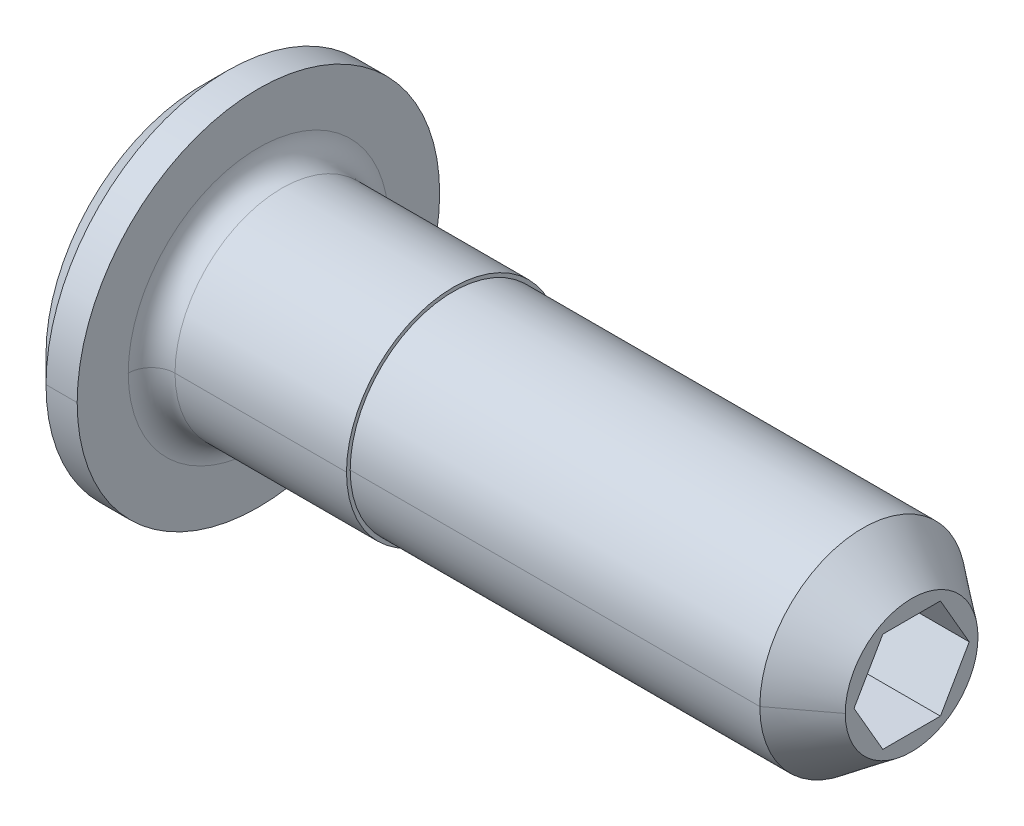
ISO-10303-21;
HEADER;
FILE_DESCRIPTION(('STEP AP214'),'2;1');
FILE_NAME('part.step','',(''),(''),'','','');
FILE_SCHEMA(('AUTOMOTIVE_DESIGN { 1 0 10303 214 1 1 1 1 }'));
ENDSEC;
DATA;
#1=APPLICATION_CONTEXT('core data for automotive mechanical design processes');
#2=APPLICATION_PROTOCOL_DEFINITION('international standard','automotive_design',2000,#1);
#3=PRODUCT_CONTEXT('',#1,'mechanical');
#4=PRODUCT('Part','Part','',(#3));
#5=PRODUCT_RELATED_PRODUCT_CATEGORY('part','',(#4));
#6=PRODUCT_DEFINITION_FORMATION('','',#4);
#7=PRODUCT_DEFINITION_CONTEXT('part definition',#1,'design');
#8=PRODUCT_DEFINITION('design','',#6,#7);
#9=PRODUCT_DEFINITION_SHAPE('','',#8);
#10=(LENGTH_UNIT() NAMED_UNIT(*) SI_UNIT(.MILLI.,.METRE.));
#11=(NAMED_UNIT(*) PLANE_ANGLE_UNIT() SI_UNIT($,.RADIAN.));
#12=(NAMED_UNIT(*) SI_UNIT($,.STERADIAN.) SOLID_ANGLE_UNIT());
#13=UNCERTAINTY_MEASURE_WITH_UNIT(LENGTH_MEASURE(1.E-05),#10,'distance_accuracy_value','');
#14=(GEOMETRIC_REPRESENTATION_CONTEXT(3) GLOBAL_UNCERTAINTY_ASSIGNED_CONTEXT((#13)) GLOBAL_UNIT_ASSIGNED_CONTEXT((#10,
#11,#12)) REPRESENTATION_CONTEXT('',''));
#15=CARTESIAN_POINT('',(0.,0.,0.));
#16=DIRECTION('',(0.,0.,1.));
#17=DIRECTION('',(1.,0.,0.));
#18=AXIS2_PLACEMENT_3D('',#15,#16,#17);
#19=CARTESIAN_POINT('',(9.2329,0.,0.938540597594654));
#20=DIRECTION('',(0.,-0.50000000000001,-0.866025403784433));
#21=DIRECTION('',(0.,-0.866025403784433,0.50000000000001));
#22=AXIS2_PLACEMENT_3D('',#19,#20,#21);
#23=PLANE('',#22);
#24=DIRECTION('',(0.,0.866025403784433,-0.50000000000001));
#25=VECTOR('',#24,1.);
#26=CARTESIAN_POINT('',(11.5824,0.,0.938540597594654));
#27=LINE('',#26,#25);
#28=CARTESIAN_POINT('',(11.5824,0.,0.938540597594654));
#29=VERTEX_POINT('',#28);
#30=CARTESIAN_POINT('',(11.5824,0.8128,0.469270298797319));
#31=VERTEX_POINT('',#30);
#32=EDGE_CURVE('E270',#29,#31,#27,.T.);
#33=ORIENTED_EDGE('',*,*,#32,.F.);
#34=DIRECTION('',(1.,0.,0.));
#35=VECTOR('',#34,1.);
#36=CARTESIAN_POINT('',(9.2329,0.,0.938540597594654));
#37=LINE('',#36,#35);
#38=CARTESIAN_POINT('',(9.2329,0.,0.938540597594654));
#39=VERTEX_POINT('',#38);
#40=EDGE_CURVE('E10',#39,#29,#37,.T.);
#41=ORIENTED_EDGE('',*,*,#40,.F.);
#42=DIRECTION('',(0.,0.866025403784433,-0.50000000000001));
#43=VECTOR('',#42,1.);
#44=CARTESIAN_POINT('',(9.2329,0.,0.938540597594654));
#45=LINE('',#44,#43);
#46=CARTESIAN_POINT('',(9.2329,0.8128,0.469270298797319));
#47=VERTEX_POINT('',#46);
#48=EDGE_CURVE('E301',#39,#47,#45,.T.);
#49=ORIENTED_EDGE('',*,*,#48,.T.);
#50=DIRECTION('',(1.,0.,0.));
#51=VECTOR('',#50,1.);
#52=CARTESIAN_POINT('',(9.2329,0.8128,0.469270298797325));
#53=LINE('',#52,#51);
#54=EDGE_CURVE('E293',#47,#31,#53,.T.);
#55=ORIENTED_EDGE('',*,*,#54,.T.);
#56=EDGE_LOOP('',(#33,#41,#49,#55));
#57=FACE_BOUND('',#56,.T.);
#58=ADVANCED_FACE('F16',(#57),#23,.T.);
#59=CARTESIAN_POINT('',(9.2329,-0.8128,0.469270298797337));
#60=DIRECTION('',(0.,0.499999999999992,-0.866025403784443));
#61=DIRECTION('',(-1.,0.,0.));
#62=AXIS2_PLACEMENT_3D('',#59,#60,#61);
#63=PLANE('',#62);
#64=DIRECTION('',(0.,0.866025403784443,0.499999999999992));
#65=VECTOR('',#64,1.);
#66=CARTESIAN_POINT('',(11.5824,-0.8128,0.469270298797337));
#67=LINE('',#66,#65);
#68=CARTESIAN_POINT('',(11.5824,-0.8128,0.469270298797337));
#69=VERTEX_POINT('',#68);
#70=EDGE_CURVE('E266',#69,#29,#67,.T.);
#71=ORIENTED_EDGE('',*,*,#70,.F.);
#72=DIRECTION('',(1.,0.,0.));
#73=VECTOR('',#72,1.);
#74=CARTESIAN_POINT('',(9.2329,-0.8128,0.469270298797325));
#75=LINE('',#74,#73);
#76=CARTESIAN_POINT('',(9.2329,-0.8128,0.469270298797325));
#77=VERTEX_POINT('',#76);
#78=EDGE_CURVE('E19',#77,#69,#75,.T.);
#79=ORIENTED_EDGE('',*,*,#78,.F.);
#80=DIRECTION('',(0.,0.866025403784443,0.499999999999992));
#81=VECTOR('',#80,1.);
#82=CARTESIAN_POINT('',(9.2329,-0.8128,0.469270298797337));
#83=LINE('',#82,#81);
#84=EDGE_CURVE('E304',#77,#39,#83,.T.);
#85=ORIENTED_EDGE('',*,*,#84,.T.);
#86=ORIENTED_EDGE('',*,*,#40,.T.);
#87=EDGE_LOOP('',(#71,#79,#85,#86));
#88=FACE_BOUND('',#87,.T.);
#89=ADVANCED_FACE('F326',(#88),#63,.T.);
#90=CARTESIAN_POINT('',(9.2329,-0.8128,-0.469270298797325));
#91=DIRECTION('',(0.,1.,0.));
#92=DIRECTION('',(1.,0.,0.));
#93=AXIS2_PLACEMENT_3D('',#90,#91,#92);
#94=PLANE('',#93);
#95=DIRECTION('',(0.,0.,1.));
#96=VECTOR('',#95,1.);
#97=CARTESIAN_POINT('',(11.5824,-0.8128,-0.469270298797325));
#98=LINE('',#97,#96);
#99=CARTESIAN_POINT('',(11.5824,-0.8128,-0.469270298797325));
#100=VERTEX_POINT('',#99);
#101=EDGE_CURVE('E271',#100,#69,#98,.T.);
#102=ORIENTED_EDGE('',*,*,#101,.F.);
#103=DIRECTION('',(1.,0.,0.));
#104=VECTOR('',#103,1.);
#105=CARTESIAN_POINT('',(9.2329,-0.8128,-0.469270298797325));
#106=LINE('',#105,#104);
#107=CARTESIAN_POINT('',(9.2329,-0.8128,-0.469270298797325));
#108=VERTEX_POINT('',#107);
#109=EDGE_CURVE('E49',#108,#100,#106,.T.);
#110=ORIENTED_EDGE('',*,*,#109,.F.);
#111=DIRECTION('',(0.,0.,1.));
#112=VECTOR('',#111,1.);
#113=CARTESIAN_POINT('',(9.2329,-0.8128,-0.469270298797325));
#114=LINE('',#113,#112);
#115=EDGE_CURVE('E241',#108,#77,#114,.T.);
#116=ORIENTED_EDGE('',*,*,#115,.T.);
#117=ORIENTED_EDGE('',*,*,#78,.T.);
#118=EDGE_LOOP('',(#102,#110,#116,#117));
#119=FACE_BOUND('',#118,.T.);
#120=ADVANCED_FACE('F321',(#119),#94,.T.);
#121=CARTESIAN_POINT('',(9.2329,0.,-0.938540597594654));
#122=DIRECTION('',(0.,0.5,0.866025403784436));
#123=DIRECTION('',(1.,0.,0.));
#124=AXIS2_PLACEMENT_3D('',#121,#122,#123);
#125=PLANE('',#124);
#126=DIRECTION('',(0.,-0.866025403784436,0.5));
#127=VECTOR('',#126,1.);
#128=CARTESIAN_POINT('',(11.5824,0.,-0.938540597594654));
#129=LINE('',#128,#127);
#130=CARTESIAN_POINT('',(11.5824,0.,-0.938540597594654));
#131=VERTEX_POINT('',#130);
#132=EDGE_CURVE('E265',#131,#100,#129,.T.);
#133=ORIENTED_EDGE('',*,*,#132,.F.);
#134=DIRECTION('',(1.,0.,0.));
#135=VECTOR('',#134,1.);
#136=CARTESIAN_POINT('',(9.2329,0.,-0.938540597594654));
#137=LINE('',#136,#135);
#138=CARTESIAN_POINT('',(9.2329,0.,-0.938540597594654));
#139=VERTEX_POINT('',#138);
#140=EDGE_CURVE('E38',#139,#131,#137,.T.);
#141=ORIENTED_EDGE('',*,*,#140,.F.);
#142=DIRECTION('',(0.,-0.866025403784436,0.5));
#143=VECTOR('',#142,1.);
#144=CARTESIAN_POINT('',(9.2329,0.,-0.938540597594654));
#145=LINE('',#144,#143);
#146=EDGE_CURVE('E237',#139,#108,#145,.T.);
#147=ORIENTED_EDGE('',*,*,#146,.T.);
#148=ORIENTED_EDGE('',*,*,#109,.T.);
#149=EDGE_LOOP('',(#133,#141,#147,#148));
#150=FACE_BOUND('',#149,.T.);
#151=ADVANCED_FACE('F399',(#150),#125,.T.);
#152=CARTESIAN_POINT('',(9.2329,0.8128,-0.469270298797331));
#153=DIRECTION('',(0.,-0.5,0.86602540378444));
#154=DIRECTION('',(-1.,0.,0.));
#155=AXIS2_PLACEMENT_3D('',#152,#153,#154);
#156=PLANE('',#155);
#157=DIRECTION('',(0.,-0.86602540378444,-0.5));
#158=VECTOR('',#157,1.);
#159=CARTESIAN_POINT('',(11.5824,0.8128,-0.469270298797331));
#160=LINE('',#159,#158);
#161=CARTESIAN_POINT('',(11.5824,0.8128,-0.469270298797331));
#162=VERTEX_POINT('',#161);
#163=EDGE_CURVE('E261',#162,#131,#160,.T.);
#164=ORIENTED_EDGE('',*,*,#163,.F.);
#165=DIRECTION('',(1.,0.,0.));
#166=VECTOR('',#165,1.);
#167=CARTESIAN_POINT('',(9.2329,0.8128,-0.469270298797325));
#168=LINE('',#167,#166);
#169=CARTESIAN_POINT('',(9.2329,0.8128,-0.469270298797331));
#170=VERTEX_POINT('',#169);
#171=EDGE_CURVE('E300',#170,#162,#168,.T.);
#172=ORIENTED_EDGE('',*,*,#171,.F.);
#173=DIRECTION('',(0.,-0.86602540378444,-0.5));
#174=VECTOR('',#173,1.);
#175=CARTESIAN_POINT('',(9.2329,0.8128,-0.469270298797331));
#176=LINE('',#175,#174);
#177=EDGE_CURVE('E240',#170,#139,#176,.T.);
#178=ORIENTED_EDGE('',*,*,#177,.T.);
#179=ORIENTED_EDGE('',*,*,#140,.T.);
#180=EDGE_LOOP('',(#164,#172,#178,#179));
#181=FACE_BOUND('',#180,.T.);
#182=ADVANCED_FACE('F394',(#181),#156,.T.);
#183=CARTESIAN_POINT('',(9.2329,0.,0.));
#184=DIRECTION('',(-1.,0.,0.));
#185=DIRECTION('',(0.,0.,1.));
#186=AXIS2_PLACEMENT_3D('',#183,#184,#185);
#187=PLANE('',#186);
#188=DIRECTION('',(0.,0.,-1.));
#189=VECTOR('',#188,1.);
#190=CARTESIAN_POINT('',(9.2329,0.8128,0.469270298797325));
#191=LINE('',#190,#189);
#192=EDGE_CURVE('E296',#47,#170,#191,.T.);
#193=ORIENTED_EDGE('',*,*,#192,.F.);
#194=ORIENTED_EDGE('',*,*,#48,.F.);
#195=ORIENTED_EDGE('',*,*,#84,.F.);
#196=ORIENTED_EDGE('',*,*,#115,.F.);
#197=ORIENTED_EDGE('',*,*,#146,.F.);
#198=ORIENTED_EDGE('',*,*,#177,.F.);
#199=EDGE_LOOP('',(#193,#194,#195,#196,#197,#198));
#200=FACE_BOUND('',#199,.T.);
#201=ADVANCED_FACE('F398',(#200),#187,.F.);
#202=CARTESIAN_POINT('',(9.2329,0.8128,0.469270298797325));
#203=DIRECTION('',(0.,-1.,0.));
#204=DIRECTION('',(0.,0.,-1.));
#205=AXIS2_PLACEMENT_3D('',#202,#203,#204);
#206=PLANE('',#205);
#207=DIRECTION('',(0.,0.,-1.));
#208=VECTOR('',#207,1.);
#209=CARTESIAN_POINT('',(11.5824,0.8128,0.469270298797325));
#210=LINE('',#209,#208);
#211=EDGE_CURVE('E278',#31,#162,#210,.T.);
#212=ORIENTED_EDGE('',*,*,#211,.F.);
#213=ORIENTED_EDGE('',*,*,#54,.F.);
#214=ORIENTED_EDGE('',*,*,#192,.T.);
#215=ORIENTED_EDGE('',*,*,#171,.T.);
#216=EDGE_LOOP('',(#212,#213,#214,#215));
#217=FACE_BOUND('',#216,.T.);
#218=ADVANCED_FACE('F411',(#217),#206,.T.);
#219=CARTESIAN_POINT('',(0.,0.,0.));
#220=DIRECTION('',(1.,0.,0.));
#221=DIRECTION('',(0.,1.,0.));
#222=AXIS2_PLACEMENT_3D('',#219,#220,#221);
#223=PLANE('',#222);
#224=CARTESIAN_POINT('',(0.,0.,0.));
#225=DIRECTION('',(-1.,0.,0.));
#226=DIRECTION('',(0.,0.,1.));
#227=AXIS2_PLACEMENT_3D('',#224,#225,#226);
#228=CIRCLE('',#227,2.52095);
#229=CARTESIAN_POINT('',(0.,0.,-2.52095));
#230=VERTEX_POINT('',#229);
#231=CARTESIAN_POINT('',(0.,0.,2.52095));
#232=VERTEX_POINT('',#231);
#233=EDGE_CURVE('E290',#230,#232,#228,.T.);
#234=ORIENTED_EDGE('',*,*,#233,.T.);
#235=CARTESIAN_POINT('',(0.,0.,0.));
#236=DIRECTION('',(-1.,0.,0.));
#237=DIRECTION('',(0.,0.,1.));
#238=AXIS2_PLACEMENT_3D('',#235,#236,#237);
#239=CIRCLE('',#238,2.52095);
#240=EDGE_CURVE('E341',#232,#230,#239,.T.);
#241=ORIENTED_EDGE('',*,*,#240,.T.);
#242=EDGE_LOOP('',(#234,#241));
#243=FACE_BOUND('',#242,.T.);
#244=ADVANCED_FACE('F414',(#243),#223,.F.);
#245=CARTESIAN_POINT('',(0.431800000000093,0.,0.));
#246=DIRECTION('',(1.,0.,0.));
#247=DIRECTION('',(0.,0.,-1.));
#248=AXIS2_PLACEMENT_3D('',#245,#246,#247);
#249=CONICAL_SURFACE('',#248,2.95275,0.785398163397341);
#250=DIRECTION('',(0.707106781186623,0.,0.707106781186472));
#251=VECTOR('',#250,1.);
#252=CARTESIAN_POINT('',(0.431800000000093,0.,2.95275));
#253=LINE('',#252,#251);
#254=CARTESIAN_POINT('',(0.431800000000093,0.,2.95275));
#255=VERTEX_POINT('',#254);
#256=EDGE_CURVE('E338',#232,#255,#253,.T.);
#257=ORIENTED_EDGE('',*,*,#256,.F.);
#258=ORIENTED_EDGE('',*,*,#233,.F.);
#259=DIRECTION('',(0.707106781186623,0.,-0.707106781186472));
#260=VECTOR('',#259,1.);
#261=CARTESIAN_POINT('',(0.431800000000093,0.,-2.95275));
#262=LINE('',#261,#260);
#263=CARTESIAN_POINT('',(0.431800000000093,0.,-2.95275));
#264=VERTEX_POINT('',#263);
#265=EDGE_CURVE('E185',#230,#264,#262,.T.);
#266=ORIENTED_EDGE('',*,*,#265,.T.);
#267=CARTESIAN_POINT('',(0.431800000000093,0.,0.));
#268=DIRECTION('',(-1.,0.,0.));
#269=DIRECTION('',(0.,0.,1.));
#270=AXIS2_PLACEMENT_3D('',#267,#268,#269);
#271=CIRCLE('',#270,2.95275);
#272=EDGE_CURVE('E171',#264,#255,#271,.T.);
#273=ORIENTED_EDGE('',*,*,#272,.T.);
#274=EDGE_LOOP('',(#257,#258,#266,#273));
#275=FACE_BOUND('',#274,.T.);
#276=ADVANCED_FACE('F417',(#275),#249,.T.);
#277=CARTESIAN_POINT('',(-1000.,0.,0.));
#278=DIRECTION('',(-1.,0.,0.));
#279=DIRECTION('',(0.,0.,1.));
#280=AXIS2_PLACEMENT_3D('',#277,#278,#279);
#281=CYLINDRICAL_SURFACE('',#280,2.95275);
#282=DIRECTION('',(-1.,0.,0.));
#283=VECTOR('',#282,1.);
#284=CARTESIAN_POINT('',(-1000.,0.,-2.95275));
#285=LINE('',#284,#283);
#286=CARTESIAN_POINT('',(0.939800000000046,0.,-2.95275));
#287=VERTEX_POINT('',#286);
#288=EDGE_CURVE('E175',#287,#264,#285,.T.);
#289=ORIENTED_EDGE('',*,*,#288,.F.);
#290=CARTESIAN_POINT('',(0.939800000000046,0.,0.));
#291=DIRECTION('',(-1.,0.,0.));
#292=DIRECTION('',(0.,0.,1.));
#293=AXIS2_PLACEMENT_3D('',#290,#291,#292);
#294=CIRCLE('',#293,2.95275);
#295=CARTESIAN_POINT('',(0.939800000000046,0.,2.95275));
#296=VERTEX_POINT('',#295);
#297=EDGE_CURVE('E162',#287,#296,#294,.T.);
#298=ORIENTED_EDGE('',*,*,#297,.T.);
#299=DIRECTION('',(-1.,0.,0.));
#300=VECTOR('',#299,1.);
#301=CARTESIAN_POINT('',(-1000.,0.,2.95275));
#302=LINE('',#301,#300);
#303=EDGE_CURVE('E181',#296,#255,#302,.T.);
#304=ORIENTED_EDGE('',*,*,#303,.T.);
#305=ORIENTED_EDGE('',*,*,#272,.F.);
#306=EDGE_LOOP('',(#289,#298,#304,#305));
#307=FACE_BOUND('',#306,.T.);
#308=ADVANCED_FACE('F176',(#307),#281,.T.);
#309=CARTESIAN_POINT('',(0.9398,2.95275,0.));
#310=DIRECTION('',(-1.,0.,0.));
#311=DIRECTION('',(0.,0.,1.));
#312=AXIS2_PLACEMENT_3D('',#309,#310,#311);
#313=PLANE('',#312);
#314=CARTESIAN_POINT('',(0.939800000000046,0.,0.));
#315=DIRECTION('',(-1.,0.,0.));
#316=DIRECTION('',(0.,0.,1.));
#317=AXIS2_PLACEMENT_3D('',#314,#315,#316);
#318=CIRCLE('',#317,2.1209);
#319=CARTESIAN_POINT('',(0.939800000000024,0.,2.1209));
#320=VERTEX_POINT('',#319);
#321=CARTESIAN_POINT('',(0.939800000000024,0.,-2.1209));
#322=VERTEX_POINT('',#321);
#323=EDGE_CURVE('E172',#320,#322,#318,.T.);
#324=ORIENTED_EDGE('',*,*,#323,.T.);
#325=CARTESIAN_POINT('',(0.939800000000046,0.,0.));
#326=DIRECTION('',(-1.,0.,0.));
#327=DIRECTION('',(0.,0.,1.));
#328=AXIS2_PLACEMENT_3D('',#325,#326,#327);
#329=CIRCLE('',#328,2.1209);
#330=EDGE_CURVE('E195',#322,#320,#329,.T.);
#331=ORIENTED_EDGE('',*,*,#330,.T.);
#332=EDGE_LOOP('',(#324,#331));
#333=FACE_BOUND('',#332,.T.);
#334=CARTESIAN_POINT('',(0.939800000000046,0.,0.));
#335=DIRECTION('',(-1.,0.,0.));
#336=DIRECTION('',(0.,0.,1.));
#337=AXIS2_PLACEMENT_3D('',#334,#335,#336);
#338=CIRCLE('',#337,2.95275);
#339=EDGE_CURVE('E166',#296,#287,#338,.T.);
#340=ORIENTED_EDGE('',*,*,#339,.F.);
#341=ORIENTED_EDGE('',*,*,#297,.F.);
#342=EDGE_LOOP('',(#340,#341));
#343=FACE_BOUND('',#342,.T.);
#344=ADVANCED_FACE('F164',(#333,#343),#313,.F.);
#345=CARTESIAN_POINT('',(1.3208,0.,0.));
#346=DIRECTION('',(-1.,0.,0.));
#347=DIRECTION('',(0.,0.,1.));
#348=AXIS2_PLACEMENT_3D('',#345,#346,#347);
#349=TOROIDAL_SURFACE('',#348,2.1209,0.381);
#350=CARTESIAN_POINT('',(1.3208,0.,-2.1209));
#351=DIRECTION('',(0.,1.,0.));
#352=DIRECTION('',(0.,0.,1.));
#353=AXIS2_PLACEMENT_3D('',#350,#351,#352);
#354=CIRCLE('',#353,0.381);
#355=CARTESIAN_POINT('',(1.3208,0.,-1.7399));
#356=VERTEX_POINT('',#355);
#357=EDGE_CURVE('E202',#322,#356,#354,.T.);
#358=ORIENTED_EDGE('',*,*,#357,.F.);
#359=ORIENTED_EDGE('',*,*,#323,.F.);
#360=CARTESIAN_POINT('',(1.3208,0.,2.1209));
#361=DIRECTION('',(0.,-1.,0.));
#362=DIRECTION('',(0.,0.,-1.));
#363=AXIS2_PLACEMENT_3D('',#360,#361,#362);
#364=CIRCLE('',#363,0.381);
#365=CARTESIAN_POINT('',(1.3208,0.,1.7399));
#366=VERTEX_POINT('',#365);
#367=EDGE_CURVE('E201',#320,#366,#364,.T.);
#368=ORIENTED_EDGE('',*,*,#367,.T.);
#369=CARTESIAN_POINT('',(1.3208,0.,0.));
#370=DIRECTION('',(-1.,0.,0.));
#371=DIRECTION('',(0.,0.,1.));
#372=AXIS2_PLACEMENT_3D('',#369,#370,#371);
#373=CIRCLE('',#372,1.7399);
#374=EDGE_CURVE('E207',#366,#356,#373,.T.);
#375=ORIENTED_EDGE('',*,*,#374,.T.);
#376=EDGE_LOOP('',(#358,#359,#368,#375));
#377=FACE_BOUND('',#376,.T.);
#378=ADVANCED_FACE('F419',(#377),#349,.F.);
#379=CARTESIAN_POINT('',(-1000.,0.,0.));
#380=DIRECTION('',(-1.,0.,0.));
#381=DIRECTION('',(0.,0.,1.));
#382=AXIS2_PLACEMENT_3D('',#379,#380,#381);
#383=CYLINDRICAL_SURFACE('',#382,1.7399);
#384=DIRECTION('',(-1.,0.,0.));
#385=VECTOR('',#384,1.);
#386=CARTESIAN_POINT('',(-1000.,0.,-1.7399));
#387=LINE('',#386,#385);
#388=CARTESIAN_POINT('',(4.1148,0.,-1.7399));
#389=VERTEX_POINT('',#388);
#390=EDGE_CURVE('E203',#389,#356,#387,.T.);
#391=ORIENTED_EDGE('',*,*,#390,.F.);
#392=CARTESIAN_POINT('',(4.1148,0.,0.));
#393=DIRECTION('',(-1.,0.,0.));
#394=DIRECTION('',(0.,0.,1.));
#395=AXIS2_PLACEMENT_3D('',#392,#393,#394);
#396=CIRCLE('',#395,1.7399);
#397=CARTESIAN_POINT('',(4.1148,0.,1.7399));
#398=VERTEX_POINT('',#397);
#399=EDGE_CURVE('E245',#389,#398,#396,.T.);
#400=ORIENTED_EDGE('',*,*,#399,.T.);
#401=DIRECTION('',(-1.,0.,0.));
#402=VECTOR('',#401,1.);
#403=CARTESIAN_POINT('',(-1000.,0.,1.7399));
#404=LINE('',#403,#402);
#405=EDGE_CURVE('E220',#398,#366,#404,.T.);
#406=ORIENTED_EDGE('',*,*,#405,.T.);
#407=CARTESIAN_POINT('',(1.3208,0.,0.));
#408=DIRECTION('',(-1.,0.,0.));
#409=DIRECTION('',(0.,0.,1.));
#410=AXIS2_PLACEMENT_3D('',#407,#408,#409);
#411=CIRCLE('',#410,1.7399);
#412=EDGE_CURVE('E197',#356,#366,#411,.T.);
#413=ORIENTED_EDGE('',*,*,#412,.F.);
#414=EDGE_LOOP('',(#391,#400,#406,#413));
#415=FACE_BOUND('',#414,.T.);
#416=ADVANCED_FACE('F422',(#415),#383,.T.);
#417=CARTESIAN_POINT('',(4.1148,1.7399,0.));
#418=DIRECTION('',(-1.,0.,0.));
#419=DIRECTION('',(0.,0.,1.));
#420=AXIS2_PLACEMENT_3D('',#417,#418,#419);
#421=PLANE('',#420);
#422=CARTESIAN_POINT('',(4.1148,0.,0.));
#423=DIRECTION('',(-1.,0.,0.));
#424=DIRECTION('',(0.,0.,1.));
#425=AXIS2_PLACEMENT_3D('',#422,#423,#424);
#426=CIRCLE('',#425,1.679575);
#427=CARTESIAN_POINT('',(4.1148,0.,1.679575));
#428=VERTEX_POINT('',#427);
#429=CARTESIAN_POINT('',(4.1148,0.,-1.679575));
#430=VERTEX_POINT('',#429);
#431=EDGE_CURVE('E231',#428,#430,#426,.T.);
#432=ORIENTED_EDGE('',*,*,#431,.T.);
#433=CARTESIAN_POINT('',(4.1148,0.,0.));
#434=DIRECTION('',(-1.,0.,0.));
#435=DIRECTION('',(0.,0.,1.));
#436=AXIS2_PLACEMENT_3D('',#433,#434,#435);
#437=CIRCLE('',#436,1.679575);
#438=EDGE_CURVE('E242',#430,#428,#437,.T.);
#439=ORIENTED_EDGE('',*,*,#438,.T.);
#440=EDGE_LOOP('',(#432,#439));
#441=FACE_BOUND('',#440,.T.);
#442=CARTESIAN_POINT('',(4.1148,0.,0.));
#443=DIRECTION('',(-1.,0.,0.));
#444=DIRECTION('',(0.,0.,1.));
#445=AXIS2_PLACEMENT_3D('',#442,#443,#444);
#446=CIRCLE('',#445,1.7399);
#447=EDGE_CURVE('E208',#398,#389,#446,.T.);
#448=ORIENTED_EDGE('',*,*,#447,.F.);
#449=ORIENTED_EDGE('',*,*,#399,.F.);
#450=EDGE_LOOP('',(#448,#449));
#451=FACE_BOUND('',#450,.T.);
#452=ADVANCED_FACE('F358',(#441,#451),#421,.F.);
#453=CARTESIAN_POINT('',(-1000.,0.,0.));
#454=DIRECTION('',(-1.,0.,0.));
#455=DIRECTION('',(0.,0.,1.));
#456=AXIS2_PLACEMENT_3D('',#453,#454,#455);
#457=CYLINDRICAL_SURFACE('',#456,1.679575);
#458=DIRECTION('',(-1.,0.,0.));
#459=VECTOR('',#458,1.);
#460=CARTESIAN_POINT('',(-1000.,0.,-1.679575));
#461=LINE('',#460,#459);
#462=CARTESIAN_POINT('',(10.78865,0.,-1.679575));
#463=VERTEX_POINT('',#462);
#464=EDGE_CURVE('E227',#463,#430,#461,.T.);
#465=ORIENTED_EDGE('',*,*,#464,.F.);
#466=CARTESIAN_POINT('',(10.78865,0.,0.));
#467=DIRECTION('',(-1.,0.,0.));
#468=DIRECTION('',(0.,0.,1.));
#469=AXIS2_PLACEMENT_3D('',#466,#467,#468);
#470=CIRCLE('',#469,1.679575);
#471=CARTESIAN_POINT('',(10.78865,0.,1.679575));
#472=VERTEX_POINT('',#471);
#473=EDGE_CURVE('E246',#463,#472,#470,.T.);
#474=ORIENTED_EDGE('',*,*,#473,.T.);
#475=DIRECTION('',(-1.,0.,0.));
#476=VECTOR('',#475,1.);
#477=CARTESIAN_POINT('',(-1000.,0.,1.679575));
#478=LINE('',#477,#476);
#479=EDGE_CURVE('E232',#472,#428,#478,.T.);
#480=ORIENTED_EDGE('',*,*,#479,.T.);
#481=ORIENTED_EDGE('',*,*,#438,.F.);
#482=EDGE_LOOP('',(#465,#474,#480,#481));
#483=FACE_BOUND('',#482,.T.);
#484=ADVANCED_FACE('F366',(#483),#457,.T.);
#485=CARTESIAN_POINT('',(11.5824,0.,0.));
#486=DIRECTION('',(-1.,0.,0.));
#487=DIRECTION('',(0.,0.,1.));
#488=AXIS2_PLACEMENT_3D('',#485,#486,#487);
#489=CONICAL_SURFACE('',#488,1.08144147273091,0.645771823237947);
#490=DIRECTION('',(-0.798635510047266,0.,-0.601815023152085));
#491=VECTOR('',#490,1.);
#492=CARTESIAN_POINT('',(11.5824,0.,-1.08144147273091));
#493=LINE('',#492,#491);
#494=CARTESIAN_POINT('',(11.5824,0.,-1.08144147273091));
#495=VERTEX_POINT('',#494);
#496=EDGE_CURVE('E250',#495,#463,#493,.T.);
#497=ORIENTED_EDGE('',*,*,#496,.F.);
#498=CARTESIAN_POINT('',(11.5824,0.,0.));
#499=DIRECTION('',(-1.,0.,0.));
#500=DIRECTION('',(0.,0.,1.));
#501=AXIS2_PLACEMENT_3D('',#498,#499,#500);
#502=CIRCLE('',#501,1.08144147273091);
#503=CARTESIAN_POINT('',(11.5824,0.,1.08144147273091));
#504=VERTEX_POINT('',#503);
#505=EDGE_CURVE('E257',#495,#504,#502,.T.);
#506=ORIENTED_EDGE('',*,*,#505,.T.);
#507=DIRECTION('',(-0.798635510047266,0.,0.601815023152085));
#508=VECTOR('',#507,1.);
#509=CARTESIAN_POINT('',(11.5824,0.,1.08144147273091));
#510=LINE('',#509,#508);
#511=EDGE_CURVE('E254',#504,#472,#510,.T.);
#512=ORIENTED_EDGE('',*,*,#511,.T.);
#513=ORIENTED_EDGE('',*,*,#473,.F.);
#514=EDGE_LOOP('',(#497,#506,#512,#513));
#515=FACE_BOUND('',#514,.T.);
#516=ADVANCED_FACE('F373',(#515),#489,.T.);
#517=CARTESIAN_POINT('',(11.5824,1.08144147273091,0.));
#518=DIRECTION('',(-1.,0.,0.));
#519=DIRECTION('',(0.,0.,1.));
#520=AXIS2_PLACEMENT_3D('',#517,#518,#519);
#521=PLANE('',#520);
#522=ORIENTED_EDGE('',*,*,#163,.T.);
#523=ORIENTED_EDGE('',*,*,#132,.T.);
#524=ORIENTED_EDGE('',*,*,#101,.T.);
#525=ORIENTED_EDGE('',*,*,#70,.T.);
#526=ORIENTED_EDGE('',*,*,#32,.T.);
#527=ORIENTED_EDGE('',*,*,#211,.T.);
#528=EDGE_LOOP('',(#522,#523,#524,#525,#526,#527));
#529=FACE_BOUND('',#528,.T.);
#530=CARTESIAN_POINT('',(11.5824,0.,0.));
#531=DIRECTION('',(-1.,0.,0.));
#532=DIRECTION('',(0.,0.,1.));
#533=AXIS2_PLACEMENT_3D('',#530,#531,#532);
#534=CIRCLE('',#533,1.08144147273091);
#535=EDGE_CURVE('E236',#504,#495,#534,.T.);
#536=ORIENTED_EDGE('',*,*,#535,.F.);
#537=ORIENTED_EDGE('',*,*,#505,.F.);
#538=EDGE_LOOP('',(#536,#537));
#539=FACE_BOUND('',#538,.T.);
#540=ADVANCED_FACE('F329',(#529,#539),#521,.F.);
#541=CARTESIAN_POINT('',(11.5824,0.,0.));
#542=DIRECTION('',(-1.,0.,0.));
#543=DIRECTION('',(0.,0.,1.));
#544=AXIS2_PLACEMENT_3D('',#541,#542,#543);
#545=CONICAL_SURFACE('',#544,1.08144147273091,0.645771823237947);
#546=ORIENTED_EDGE('',*,*,#535,.T.);
#547=ORIENTED_EDGE('',*,*,#496,.T.);
#548=CARTESIAN_POINT('',(10.78865,0.,0.));
#549=DIRECTION('',(-1.,0.,0.));
#550=DIRECTION('',(0.,0.,1.));
#551=AXIS2_PLACEMENT_3D('',#548,#549,#550);
#552=CIRCLE('',#551,1.679575);
#553=EDGE_CURVE('E223',#472,#463,#552,.T.);
#554=ORIENTED_EDGE('',*,*,#553,.F.);
#555=ORIENTED_EDGE('',*,*,#511,.F.);
#556=EDGE_LOOP('',(#546,#547,#554,#555));
#557=FACE_BOUND('',#556,.T.);
#558=ADVANCED_FACE('F369',(#557),#545,.T.);
#559=CARTESIAN_POINT('',(-1000.,0.,0.));
#560=DIRECTION('',(-1.,0.,0.));
#561=DIRECTION('',(0.,0.,1.));
#562=AXIS2_PLACEMENT_3D('',#559,#560,#561);
#563=CYLINDRICAL_SURFACE('',#562,1.679575);
#564=ORIENTED_EDGE('',*,*,#553,.T.);
#565=ORIENTED_EDGE('',*,*,#464,.T.);
#566=ORIENTED_EDGE('',*,*,#431,.F.);
#567=ORIENTED_EDGE('',*,*,#479,.F.);
#568=EDGE_LOOP('',(#564,#565,#566,#567));
#569=FACE_BOUND('',#568,.T.);
#570=ADVANCED_FACE('F363',(#569),#563,.T.);
#571=CARTESIAN_POINT('',(-1000.,0.,0.));
#572=DIRECTION('',(-1.,0.,0.));
#573=DIRECTION('',(0.,0.,1.));
#574=AXIS2_PLACEMENT_3D('',#571,#572,#573);
#575=CYLINDRICAL_SURFACE('',#574,1.7399);
#576=ORIENTED_EDGE('',*,*,#447,.T.);
#577=ORIENTED_EDGE('',*,*,#390,.T.);
#578=ORIENTED_EDGE('',*,*,#374,.F.);
#579=ORIENTED_EDGE('',*,*,#405,.F.);
#580=EDGE_LOOP('',(#576,#577,#578,#579));
#581=FACE_BOUND('',#580,.T.);
#582=ADVANCED_FACE('F447',(#581),#575,.T.);
#583=CARTESIAN_POINT('',(1.3208,0.,0.));
#584=DIRECTION('',(-1.,0.,0.));
#585=DIRECTION('',(0.,0.,1.));
#586=AXIS2_PLACEMENT_3D('',#583,#584,#585);
#587=TOROIDAL_SURFACE('',#586,2.1209,0.381);
#588=ORIENTED_EDGE('',*,*,#330,.F.);
#589=ORIENTED_EDGE('',*,*,#357,.T.);
#590=ORIENTED_EDGE('',*,*,#412,.T.);
#591=ORIENTED_EDGE('',*,*,#367,.F.);
#592=EDGE_LOOP('',(#588,#589,#590,#591));
#593=FACE_BOUND('',#592,.T.);
#594=ADVANCED_FACE('F444',(#593),#587,.F.);
#595=CARTESIAN_POINT('',(-1000.,0.,0.));
#596=DIRECTION('',(-1.,0.,0.));
#597=DIRECTION('',(0.,0.,1.));
#598=AXIS2_PLACEMENT_3D('',#595,#596,#597);
#599=CYLINDRICAL_SURFACE('',#598,2.95275);
#600=ORIENTED_EDGE('',*,*,#339,.T.);
#601=ORIENTED_EDGE('',*,*,#288,.T.);
#602=CARTESIAN_POINT('',(0.431800000000093,0.,0.));
#603=DIRECTION('',(-1.,0.,0.));
#604=DIRECTION('',(0.,0.,1.));
#605=AXIS2_PLACEMENT_3D('',#602,#603,#604);
#606=CIRCLE('',#605,2.95275);
#607=EDGE_CURVE('E191',#255,#264,#606,.T.);
#608=ORIENTED_EDGE('',*,*,#607,.F.);
#609=ORIENTED_EDGE('',*,*,#303,.F.);
#610=EDGE_LOOP('',(#600,#601,#608,#609));
#611=FACE_BOUND('',#610,.T.);
#612=ADVANCED_FACE('F183',(#611),#599,.T.);
#613=CARTESIAN_POINT('',(0.431800000000093,0.,0.));
#614=DIRECTION('',(1.,0.,0.));
#615=DIRECTION('',(0.,0.,-1.));
#616=AXIS2_PLACEMENT_3D('',#613,#614,#615);
#617=CONICAL_SURFACE('',#616,2.95275,0.785398163397341);
#618=ORIENTED_EDGE('',*,*,#240,.F.);
#619=ORIENTED_EDGE('',*,*,#256,.T.);
#620=ORIENTED_EDGE('',*,*,#607,.T.);
#621=ORIENTED_EDGE('',*,*,#265,.F.);
#622=EDGE_LOOP('',(#618,#619,#620,#621));
#623=FACE_BOUND('',#622,.T.);
#624=ADVANCED_FACE('F443',(#623),#617,.T.);
#625=CLOSED_SHELL('',(#58,#89,#120,#151,#182,#201,#218,#244,#276,#308,#344,#378,#416,#452,#484,
#516,#540,#558,#570,#582,#594,#612,#624));
#626=MANIFOLD_SOLID_BREP('B1',#625);
#627=ADVANCED_BREP_SHAPE_REPRESENTATION('',(#18,#626),#14);
#628=SHAPE_DEFINITION_REPRESENTATION(#9,#627);
ENDSEC;
END-ISO-10303-21;
